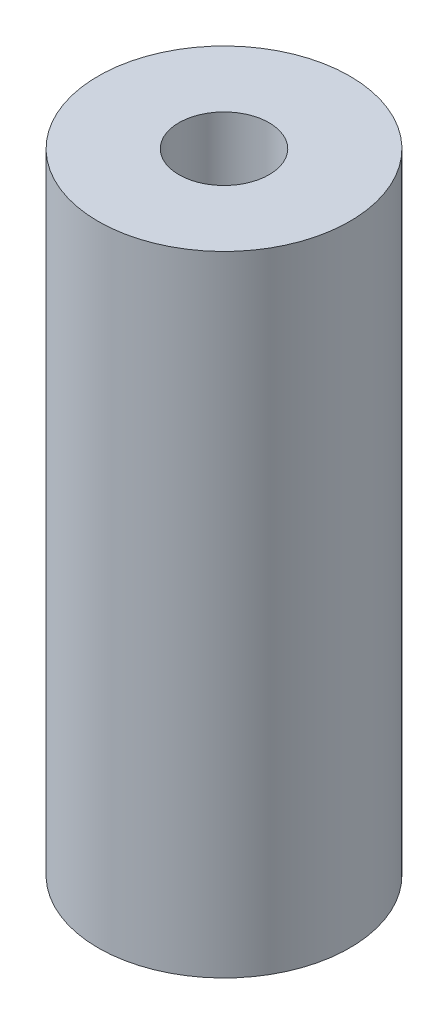
ISO-10303-21;
HEADER;
FILE_DESCRIPTION(('STEP AP214'),'2;1');
FILE_NAME('part.step','',(''),(''),'','','');
FILE_SCHEMA(('AUTOMOTIVE_DESIGN { 1 0 10303 214 1 1 1 1 }'));
ENDSEC;
DATA;
#1=APPLICATION_CONTEXT('core data for automotive mechanical design processes');
#2=APPLICATION_PROTOCOL_DEFINITION('international standard','automotive_design',2000,#1);
#3=PRODUCT_CONTEXT('',#1,'mechanical');
#4=PRODUCT('Part','Part','',(#3));
#5=PRODUCT_RELATED_PRODUCT_CATEGORY('part','',(#4));
#6=PRODUCT_DEFINITION_FORMATION('','',#4);
#7=PRODUCT_DEFINITION_CONTEXT('part definition',#1,'design');
#8=PRODUCT_DEFINITION('design','',#6,#7);
#9=PRODUCT_DEFINITION_SHAPE('','',#8);
#10=(LENGTH_UNIT() NAMED_UNIT(*) SI_UNIT(.MILLI.,.METRE.));
#11=(NAMED_UNIT(*) PLANE_ANGLE_UNIT() SI_UNIT($,.RADIAN.));
#12=(NAMED_UNIT(*) SI_UNIT($,.STERADIAN.) SOLID_ANGLE_UNIT());
#13=UNCERTAINTY_MEASURE_WITH_UNIT(LENGTH_MEASURE(1.E-05),#10,'distance_accuracy_value','');
#14=(GEOMETRIC_REPRESENTATION_CONTEXT(3) GLOBAL_UNCERTAINTY_ASSIGNED_CONTEXT((#13)) GLOBAL_UNIT_ASSIGNED_CONTEXT((#10,
#11,#12)) REPRESENTATION_CONTEXT('',''));
#15=CARTESIAN_POINT('',(0.,0.,0.));
#16=DIRECTION('',(0.,0.,1.));
#17=DIRECTION('',(1.,0.,0.));
#18=AXIS2_PLACEMENT_3D('',#15,#16,#17);
#19=CARTESIAN_POINT('',(0.,30.,0.));
#20=DIRECTION('',(0.,1.,0.));
#21=DIRECTION('',(0.,0.,1.));
#22=AXIS2_PLACEMENT_3D('',#19,#20,#21);
#23=PLANE('',#22);
#24=CARTESIAN_POINT('',(0.,30.,0.));
#25=DIRECTION('',(0.,1.,0.));
#26=DIRECTION('',(0.,0.,1.));
#27=AXIS2_PLACEMENT_3D('',#24,#25,#26);
#28=CIRCLE('',#27,6.);
#29=CARTESIAN_POINT('',(0.,30.,6.));
#30=VERTEX_POINT('',#29);
#31=EDGE_CURVE('E10',#30,#30,#28,.T.);
#32=ORIENTED_EDGE('',*,*,#31,.T.);
#33=EDGE_LOOP('',(#32));
#34=FACE_BOUND('',#33,.T.);
#35=CARTESIAN_POINT('',(0.,30.,0.));
#36=DIRECTION('',(0.,1.,0.));
#37=DIRECTION('',(0.,0.,1.));
#38=AXIS2_PLACEMENT_3D('',#35,#36,#37);
#39=CIRCLE('',#38,2.15);
#40=CARTESIAN_POINT('',(0.,30.,2.15));
#41=VERTEX_POINT('',#40);
#42=EDGE_CURVE('E45',#41,#41,#39,.T.);
#43=ORIENTED_EDGE('',*,*,#42,.F.);
#44=EDGE_LOOP('',(#43));
#45=FACE_BOUND('',#44,.T.);
#46=ADVANCED_FACE('F34',(#34,#45),#23,.T.);
#47=CARTESIAN_POINT('',(0.,0.,0.));
#48=DIRECTION('',(0.,1.,0.));
#49=DIRECTION('',(0.,0.,1.));
#50=AXIS2_PLACEMENT_3D('',#47,#48,#49);
#51=PLANE('',#50);
#52=CARTESIAN_POINT('',(0.,0.,0.));
#53=DIRECTION('',(0.,1.,0.));
#54=DIRECTION('',(0.,0.,1.));
#55=AXIS2_PLACEMENT_3D('',#52,#53,#54);
#56=CIRCLE('',#55,6.);
#57=CARTESIAN_POINT('',(0.,0.,6.));
#58=VERTEX_POINT('',#57);
#59=EDGE_CURVE('E38',#58,#58,#56,.T.);
#60=ORIENTED_EDGE('',*,*,#59,.F.);
#61=EDGE_LOOP('',(#60));
#62=FACE_BOUND('',#61,.T.);
#63=CARTESIAN_POINT('',(0.,0.,0.));
#64=DIRECTION('',(0.,1.,0.));
#65=DIRECTION('',(0.,0.,1.));
#66=AXIS2_PLACEMENT_3D('',#63,#64,#65);
#67=CIRCLE('',#66,2.15);
#68=CARTESIAN_POINT('',(0.,0.,2.15));
#69=VERTEX_POINT('',#68);
#70=EDGE_CURVE('E47',#69,#69,#67,.T.);
#71=ORIENTED_EDGE('',*,*,#70,.T.);
#72=EDGE_LOOP('',(#71));
#73=FACE_BOUND('',#72,.T.);
#74=ADVANCED_FACE('F57',(#62,#73),#51,.F.);
#75=CARTESIAN_POINT('',(0.,30.,0.));
#76=DIRECTION('',(0.,-1.,0.));
#77=DIRECTION('',(0.,0.,-1.));
#78=AXIS2_PLACEMENT_3D('',#75,#76,#77);
#79=CYLINDRICAL_SURFACE('',#78,6.);
#80=ORIENTED_EDGE('',*,*,#31,.F.);
#81=EDGE_LOOP('',(#80));
#82=FACE_BOUND('',#81,.T.);
#83=ORIENTED_EDGE('',*,*,#59,.T.);
#84=EDGE_LOOP('',(#83));
#85=FACE_BOUND('',#84,.T.);
#86=ADVANCED_FACE('F36',(#82,#85),#79,.T.);
#87=CARTESIAN_POINT('',(0.,30.,0.));
#88=DIRECTION('',(0.,-1.,0.));
#89=DIRECTION('',(0.,0.,-1.));
#90=AXIS2_PLACEMENT_3D('',#87,#88,#89);
#91=CYLINDRICAL_SURFACE('',#90,2.15);
#92=ORIENTED_EDGE('',*,*,#42,.T.);
#93=EDGE_LOOP('',(#92));
#94=FACE_BOUND('',#93,.T.);
#95=ORIENTED_EDGE('',*,*,#70,.F.);
#96=EDGE_LOOP('',(#95));
#97=FACE_BOUND('',#96,.T.);
#98=ADVANCED_FACE('F53',(#94,#97),#91,.F.);
#99=CLOSED_SHELL('',(#46,#74,#86,#98));
#100=MANIFOLD_SOLID_BREP('B2',#99);
#101=ADVANCED_BREP_SHAPE_REPRESENTATION('',(#18,#100),#14);
#102=SHAPE_DEFINITION_REPRESENTATION(#9,#101);
ENDSEC;
END-ISO-10303-21;
